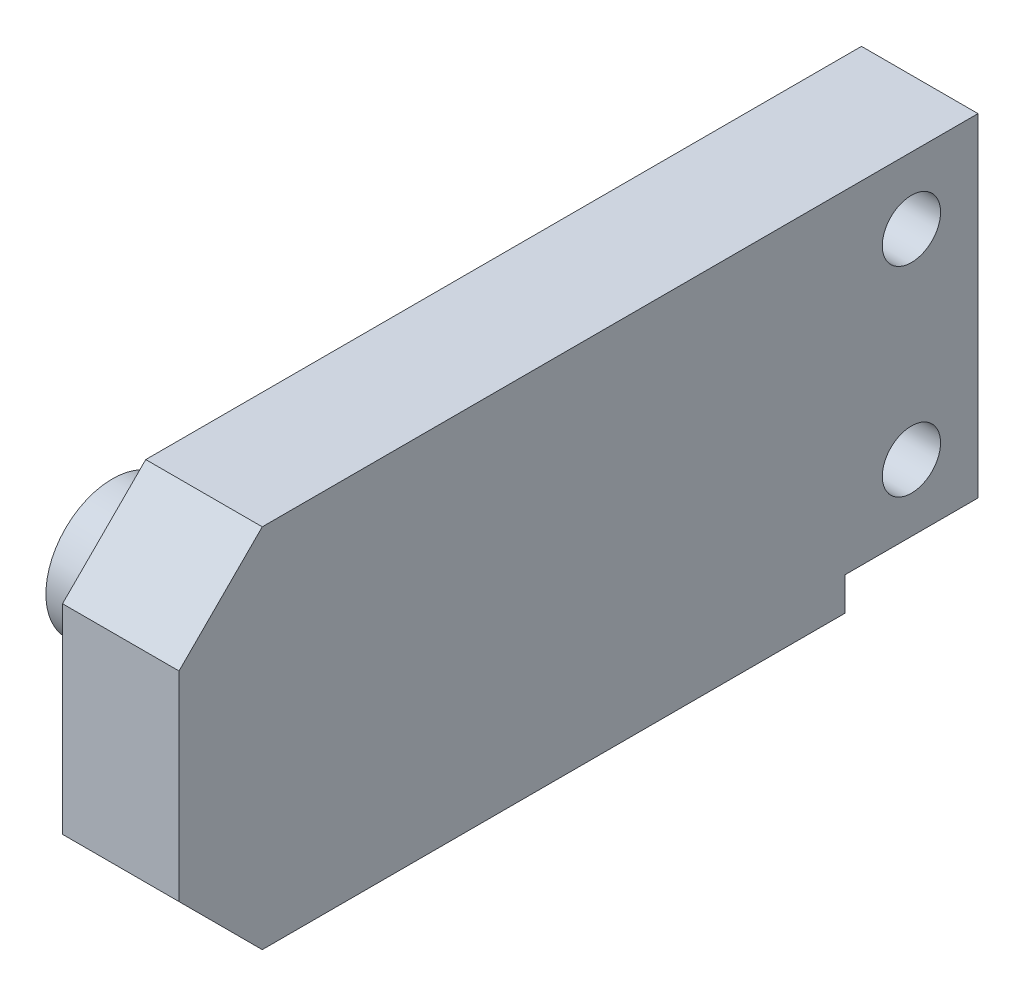
ISO-10303-21;
HEADER;
FILE_DESCRIPTION(('STEP AP214'),'2;1');
FILE_NAME('part.step','',(''),(''),'','','');
FILE_SCHEMA(('AUTOMOTIVE_DESIGN { 1 0 10303 214 1 1 1 1 }'));
ENDSEC;
DATA;
#1=APPLICATION_CONTEXT('core data for automotive mechanical design processes');
#2=APPLICATION_PROTOCOL_DEFINITION('international standard','automotive_design',2000,#1);
#3=PRODUCT_CONTEXT('',#1,'mechanical');
#4=PRODUCT('Part','Part','',(#3));
#5=PRODUCT_RELATED_PRODUCT_CATEGORY('part','',(#4));
#6=PRODUCT_DEFINITION_FORMATION('','',#4);
#7=PRODUCT_DEFINITION_CONTEXT('part definition',#1,'design');
#8=PRODUCT_DEFINITION('design','',#6,#7);
#9=PRODUCT_DEFINITION_SHAPE('','',#8);
#10=(LENGTH_UNIT() NAMED_UNIT(*) SI_UNIT(.MILLI.,.METRE.));
#11=(NAMED_UNIT(*) PLANE_ANGLE_UNIT() SI_UNIT($,.RADIAN.));
#12=(NAMED_UNIT(*) SI_UNIT($,.STERADIAN.) SOLID_ANGLE_UNIT());
#13=UNCERTAINTY_MEASURE_WITH_UNIT(LENGTH_MEASURE(1.E-05),#10,'distance_accuracy_value','');
#14=(GEOMETRIC_REPRESENTATION_CONTEXT(3) GLOBAL_UNCERTAINTY_ASSIGNED_CONTEXT((#13)) GLOBAL_UNIT_ASSIGNED_CONTEXT((#10,
#11,#12)) REPRESENTATION_CONTEXT('',''));
#15=CARTESIAN_POINT('',(0.,0.,0.));
#16=DIRECTION('',(0.,0.,1.));
#17=DIRECTION('',(1.,0.,0.));
#18=AXIS2_PLACEMENT_3D('',#15,#16,#17);
#19=CARTESIAN_POINT('',(7.,0.,10.));
#20=DIRECTION('',(0.,0.,-1.));
#21=DIRECTION('',(0.,1.,0.));
#22=AXIS2_PLACEMENT_3D('',#19,#20,#21);
#23=PLANE('',#22);
#24=DIRECTION('',(0.,-1.,0.));
#25=VECTOR('',#24,1.);
#26=CARTESIAN_POINT('',(0.,0.,10.));
#27=LINE('',#26,#25);
#28=CARTESIAN_POINT('',(0.,6.,10.));
#29=VERTEX_POINT('',#28);
#30=CARTESIAN_POINT('',(0.,-6.,10.));
#31=VERTEX_POINT('',#30);
#32=EDGE_CURVE('E151',#29,#31,#27,.T.);
#33=ORIENTED_EDGE('',*,*,#32,.T.);
#34=DIRECTION('',(-1.,0.,0.));
#35=VECTOR('',#34,1.);
#36=CARTESIAN_POINT('',(7.,-6.,10.));
#37=LINE('',#36,#35);
#38=CARTESIAN_POINT('',(7.,-6.,10.));
#39=VERTEX_POINT('',#38);
#40=EDGE_CURVE('E49',#39,#31,#37,.T.);
#41=ORIENTED_EDGE('',*,*,#40,.F.);
#42=DIRECTION('',(0.,-1.,0.));
#43=VECTOR('',#42,1.);
#44=CARTESIAN_POINT('',(7.,0.,10.));
#45=LINE('',#44,#43);
#46=CARTESIAN_POINT('',(7.,6.,10.));
#47=VERTEX_POINT('',#46);
#48=EDGE_CURVE('E193',#47,#39,#45,.T.);
#49=ORIENTED_EDGE('',*,*,#48,.F.);
#50=DIRECTION('',(-1.,0.,0.));
#51=VECTOR('',#50,1.);
#52=CARTESIAN_POINT('',(7.,6.,10.));
#53=LINE('',#52,#51);
#54=EDGE_CURVE('E139',#47,#29,#53,.T.);
#55=ORIENTED_EDGE('',*,*,#54,.T.);
#56=EDGE_LOOP('',(#33,#41,#49,#55));
#57=FACE_BOUND('',#56,.T.);
#58=ADVANCED_FACE('F41',(#57),#23,.F.);
#59=CARTESIAN_POINT('',(7.,-8.,8.));
#60=DIRECTION('',(0.,0.707106781186547,-0.707106781186548));
#61=DIRECTION('',(0.,0.707106781186548,0.707106781186547));
#62=AXIS2_PLACEMENT_3D('',#59,#60,#61);
#63=PLANE('',#62);
#64=DIRECTION('',(0.,-0.707106781186548,-0.707106781186547));
#65=VECTOR('',#64,1.);
#66=CARTESIAN_POINT('',(0.,-8.,8.));
#67=LINE('',#66,#65);
#68=CARTESIAN_POINT('',(0.,-11.,5.));
#69=VERTEX_POINT('',#68);
#70=EDGE_CURVE('E147',#31,#69,#67,.T.);
#71=ORIENTED_EDGE('',*,*,#70,.T.);
#72=DIRECTION('',(-1.,0.,0.));
#73=VECTOR('',#72,1.);
#74=CARTESIAN_POINT('',(7.,-11.,5.));
#75=LINE('',#74,#73);
#76=CARTESIAN_POINT('',(7.,-11.,5.));
#77=VERTEX_POINT('',#76);
#78=EDGE_CURVE('E137',#77,#69,#75,.T.);
#79=ORIENTED_EDGE('',*,*,#78,.F.);
#80=DIRECTION('',(0.,-0.707106781186548,-0.707106781186547));
#81=VECTOR('',#80,1.);
#82=CARTESIAN_POINT('',(7.,-8.,8.));
#83=LINE('',#82,#81);
#84=EDGE_CURVE('E100',#39,#77,#83,.T.);
#85=ORIENTED_EDGE('',*,*,#84,.F.);
#86=ORIENTED_EDGE('',*,*,#40,.T.);
#87=EDGE_LOOP('',(#71,#79,#85,#86));
#88=FACE_BOUND('',#87,.T.);
#89=ADVANCED_FACE('F146',(#88),#63,.F.);
#90=CARTESIAN_POINT('',(7.,-11.,0.));
#91=DIRECTION('',(0.,1.,0.));
#92=DIRECTION('',(0.,0.,1.));
#93=AXIS2_PLACEMENT_3D('',#90,#91,#92);
#94=PLANE('',#93);
#95=DIRECTION('',(0.,0.,-1.));
#96=VECTOR('',#95,1.);
#97=CARTESIAN_POINT('',(0.,-11.,0.));
#98=LINE('',#97,#96);
#99=CARTESIAN_POINT('',(0.,-11.,-30.));
#100=VERTEX_POINT('',#99);
#101=EDGE_CURVE('E155',#69,#100,#98,.T.);
#102=ORIENTED_EDGE('',*,*,#101,.T.);
#103=DIRECTION('',(-1.,0.,0.));
#104=VECTOR('',#103,1.);
#105=CARTESIAN_POINT('',(7.,-11.,-30.));
#106=LINE('',#105,#104);
#107=CARTESIAN_POINT('',(7.,-11.,-30.));
#108=VERTEX_POINT('',#107);
#109=EDGE_CURVE('E134',#108,#100,#106,.T.);
#110=ORIENTED_EDGE('',*,*,#109,.F.);
#111=DIRECTION('',(0.,0.,-1.));
#112=VECTOR('',#111,1.);
#113=CARTESIAN_POINT('',(7.,-11.,0.));
#114=LINE('',#113,#112);
#115=EDGE_CURVE('E126',#77,#108,#114,.T.);
#116=ORIENTED_EDGE('',*,*,#115,.F.);
#117=ORIENTED_EDGE('',*,*,#78,.T.);
#118=EDGE_LOOP('',(#102,#110,#116,#117));
#119=FACE_BOUND('',#118,.T.);
#120=ADVANCED_FACE('F198',(#119),#94,.F.);
#121=CARTESIAN_POINT('',(7.,0.,-30.));
#122=DIRECTION('',(0.,0.,1.));
#123=DIRECTION('',(1.,0.,0.));
#124=AXIS2_PLACEMENT_3D('',#121,#122,#123);
#125=PLANE('',#124);
#126=DIRECTION('',(0.,1.,0.));
#127=VECTOR('',#126,1.);
#128=CARTESIAN_POINT('',(0.,0.,-30.));
#129=LINE('',#128,#127);
#130=CARTESIAN_POINT('',(0.,-9.00000000000001,-30.));
#131=VERTEX_POINT('',#130);
#132=EDGE_CURVE('E133',#100,#131,#129,.T.);
#133=ORIENTED_EDGE('',*,*,#132,.T.);
#134=DIRECTION('',(-1.,0.,0.));
#135=VECTOR('',#134,1.);
#136=CARTESIAN_POINT('',(7.,-9.00000000000001,-30.));
#137=LINE('',#136,#135);
#138=CARTESIAN_POINT('',(7.,-9.00000000000001,-30.));
#139=VERTEX_POINT('',#138);
#140=EDGE_CURVE('E116',#139,#131,#137,.T.);
#141=ORIENTED_EDGE('',*,*,#140,.F.);
#142=DIRECTION('',(0.,1.,0.));
#143=VECTOR('',#142,1.);
#144=CARTESIAN_POINT('',(7.,0.,-30.));
#145=LINE('',#144,#143);
#146=EDGE_CURVE('E120',#108,#139,#145,.T.);
#147=ORIENTED_EDGE('',*,*,#146,.F.);
#148=ORIENTED_EDGE('',*,*,#109,.T.);
#149=EDGE_LOOP('',(#133,#141,#147,#148));
#150=FACE_BOUND('',#149,.T.);
#151=ADVANCED_FACE('F131',(#150),#125,.F.);
#152=CARTESIAN_POINT('',(7.,-9.00000000000001,0.));
#153=DIRECTION('',(0.,-1.,0.));
#154=DIRECTION('',(0.,0.,-1.));
#155=AXIS2_PLACEMENT_3D('',#152,#153,#154);
#156=PLANE('',#155);
#157=DIRECTION('',(-1.,0.,0.));
#158=VECTOR('',#157,1.);
#159=CARTESIAN_POINT('',(7.,-9.00000000000001,-38.));
#160=LINE('',#159,#158);
#161=CARTESIAN_POINT('',(7.,-9.00000000000001,-38.));
#162=VERTEX_POINT('',#161);
#163=CARTESIAN_POINT('',(0.,-9.00000000000001,-38.));
#164=VERTEX_POINT('',#163);
#165=EDGE_CURVE('E56',#162,#164,#160,.T.);
#166=ORIENTED_EDGE('',*,*,#165,.F.);
#167=DIRECTION('',(0.,0.,1.));
#168=VECTOR('',#167,1.);
#169=CARTESIAN_POINT('',(7.,-9.00000000000001,0.));
#170=LINE('',#169,#168);
#171=EDGE_CURVE('E111',#162,#139,#170,.T.);
#172=ORIENTED_EDGE('',*,*,#171,.T.);
#173=ORIENTED_EDGE('',*,*,#140,.T.);
#174=DIRECTION('',(0.,0.,1.));
#175=VECTOR('',#174,1.);
#176=CARTESIAN_POINT('',(0.,-9.00000000000001,0.));
#177=LINE('',#176,#175);
#178=EDGE_CURVE('E164',#164,#131,#177,.T.);
#179=ORIENTED_EDGE('',*,*,#178,.F.);
#180=EDGE_LOOP('',(#166,#172,#173,#179));
#181=FACE_BOUND('',#180,.T.);
#182=ADVANCED_FACE('F113',(#181),#156,.T.);
#183=CARTESIAN_POINT('',(7.,11.,0.));
#184=DIRECTION('',(0.,1.,0.));
#185=DIRECTION('',(0.,0.,1.));
#186=AXIS2_PLACEMENT_3D('',#183,#184,#185);
#187=PLANE('',#186);
#188=DIRECTION('',(1.,0.,0.));
#189=VECTOR('',#188,1.);
#190=CARTESIAN_POINT('',(7.,11.,-38.));
#191=LINE('',#190,#189);
#192=CARTESIAN_POINT('',(0.,11.,-38.));
#193=VERTEX_POINT('',#192);
#194=CARTESIAN_POINT('',(7.,11.,-38.));
#195=VERTEX_POINT('',#194);
#196=EDGE_CURVE('E206',#193,#195,#191,.T.);
#197=ORIENTED_EDGE('',*,*,#196,.F.);
#198=DIRECTION('',(0.,0.,-1.));
#199=VECTOR('',#198,1.);
#200=CARTESIAN_POINT('',(0.,11.,0.));
#201=LINE('',#200,#199);
#202=CARTESIAN_POINT('',(0.,11.,5.));
#203=VERTEX_POINT('',#202);
#204=EDGE_CURVE('E166',#203,#193,#201,.T.);
#205=ORIENTED_EDGE('',*,*,#204,.F.);
#206=DIRECTION('',(-1.,0.,0.));
#207=VECTOR('',#206,1.);
#208=CARTESIAN_POINT('',(7.,11.,5.));
#209=LINE('',#208,#207);
#210=CARTESIAN_POINT('',(7.,11.,5.));
#211=VERTEX_POINT('',#210);
#212=EDGE_CURVE('E135',#211,#203,#209,.T.);
#213=ORIENTED_EDGE('',*,*,#212,.F.);
#214=DIRECTION('',(0.,0.,-1.));
#215=VECTOR('',#214,1.);
#216=CARTESIAN_POINT('',(7.,11.,0.));
#217=LINE('',#216,#215);
#218=EDGE_CURVE('E119',#211,#195,#217,.T.);
#219=ORIENTED_EDGE('',*,*,#218,.T.);
#220=EDGE_LOOP('',(#197,#205,#213,#219));
#221=FACE_BOUND('',#220,.T.);
#222=ADVANCED_FACE('F209',(#221),#187,.T.);
#223=CARTESIAN_POINT('',(7.,7.00000000000001,-34.));
#224=DIRECTION('',(-1.,0.,0.));
#225=DIRECTION('',(0.,0.,1.));
#226=AXIS2_PLACEMENT_3D('',#223,#224,#225);
#227=CYLINDRICAL_SURFACE('',#226,1.75);
#228=CARTESIAN_POINT('',(7.,7.00000000000001,-34.));
#229=DIRECTION('',(1.,0.,0.));
#230=DIRECTION('',(0.,0.,-1.));
#231=AXIS2_PLACEMENT_3D('',#228,#229,#230);
#232=CIRCLE('',#231,1.75);
#233=CARTESIAN_POINT('',(7.,7.00000000000001,-35.75));
#234=VERTEX_POINT('',#233);
#235=EDGE_CURVE('E190',#234,#234,#232,.T.);
#236=ORIENTED_EDGE('',*,*,#235,.T.);
#237=EDGE_LOOP('',(#236));
#238=FACE_BOUND('',#237,.T.);
#239=CARTESIAN_POINT('',(0.,7.00000000000001,-34.));
#240=DIRECTION('',(1.,0.,0.));
#241=DIRECTION('',(0.,0.,-1.));
#242=AXIS2_PLACEMENT_3D('',#239,#240,#241);
#243=CIRCLE('',#242,1.75);
#244=CARTESIAN_POINT('',(0.,7.00000000000001,-35.75));
#245=VERTEX_POINT('',#244);
#246=EDGE_CURVE('E153',#245,#245,#243,.T.);
#247=ORIENTED_EDGE('',*,*,#246,.F.);
#248=EDGE_LOOP('',(#247));
#249=FACE_BOUND('',#248,.T.);
#250=ADVANCED_FACE('F220',(#238,#249),#227,.F.);
#251=CARTESIAN_POINT('',(7.,-5.,-34.));
#252=DIRECTION('',(-1.,0.,0.));
#253=DIRECTION('',(0.,0.,1.));
#254=AXIS2_PLACEMENT_3D('',#251,#252,#253);
#255=CYLINDRICAL_SURFACE('',#254,1.75);
#256=CARTESIAN_POINT('',(7.,-5.,-34.));
#257=DIRECTION('',(1.,0.,0.));
#258=DIRECTION('',(0.,0.,-1.));
#259=AXIS2_PLACEMENT_3D('',#256,#257,#258);
#260=CIRCLE('',#259,1.75);
#261=CARTESIAN_POINT('',(7.,-5.,-35.75));
#262=VERTEX_POINT('',#261);
#263=EDGE_CURVE('E169',#262,#262,#260,.T.);
#264=ORIENTED_EDGE('',*,*,#263,.T.);
#265=EDGE_LOOP('',(#264));
#266=FACE_BOUND('',#265,.T.);
#267=CARTESIAN_POINT('',(0.,-5.,-34.));
#268=DIRECTION('',(1.,0.,0.));
#269=DIRECTION('',(0.,0.,-1.));
#270=AXIS2_PLACEMENT_3D('',#267,#268,#269);
#271=CIRCLE('',#270,1.75);
#272=CARTESIAN_POINT('',(0.,-5.,-35.75));
#273=VERTEX_POINT('',#272);
#274=EDGE_CURVE('E158',#273,#273,#271,.T.);
#275=ORIENTED_EDGE('',*,*,#274,.F.);
#276=EDGE_LOOP('',(#275));
#277=FACE_BOUND('',#276,.T.);
#278=ADVANCED_FACE('F43',(#266,#277),#255,.F.);
#279=CARTESIAN_POINT('',(7.,8.,8.00000000000001));
#280=DIRECTION('',(0.,-0.707106781186547,-0.707106781186548));
#281=DIRECTION('',(0.,0.707106781186548,-0.707106781186547));
#282=AXIS2_PLACEMENT_3D('',#279,#280,#281);
#283=PLANE('',#282);
#284=DIRECTION('',(0.,-0.707106781186548,0.707106781186547));
#285=VECTOR('',#284,1.);
#286=CARTESIAN_POINT('',(0.,8.,8.00000000000001));
#287=LINE('',#286,#285);
#288=EDGE_CURVE('E91',#203,#29,#287,.T.);
#289=ORIENTED_EDGE('',*,*,#288,.T.);
#290=ORIENTED_EDGE('',*,*,#54,.F.);
#291=DIRECTION('',(0.,-0.707106781186548,0.707106781186547));
#292=VECTOR('',#291,1.);
#293=CARTESIAN_POINT('',(7.,8.,8.00000000000001));
#294=LINE('',#293,#292);
#295=EDGE_CURVE('E64',#211,#47,#294,.T.);
#296=ORIENTED_EDGE('',*,*,#295,.F.);
#297=ORIENTED_EDGE('',*,*,#212,.T.);
#298=EDGE_LOOP('',(#289,#290,#296,#297));
#299=FACE_BOUND('',#298,.T.);
#300=ADVANCED_FACE('F211',(#299),#283,.F.);
#301=CARTESIAN_POINT('',(7.,0.,0.));
#302=DIRECTION('',(1.,0.,0.));
#303=DIRECTION('',(0.,0.,-1.));
#304=AXIS2_PLACEMENT_3D('',#301,#302,#303);
#305=PLANE('',#304);
#306=DIRECTION('',(0.,-1.,0.));
#307=VECTOR('',#306,1.);
#308=CARTESIAN_POINT('',(7.,0.,-38.));
#309=LINE('',#308,#307);
#310=EDGE_CURVE('E183',#195,#162,#309,.T.);
#311=ORIENTED_EDGE('',*,*,#310,.F.);
#312=ORIENTED_EDGE('',*,*,#218,.F.);
#313=ORIENTED_EDGE('',*,*,#295,.T.);
#314=ORIENTED_EDGE('',*,*,#48,.T.);
#315=ORIENTED_EDGE('',*,*,#84,.T.);
#316=ORIENTED_EDGE('',*,*,#115,.T.);
#317=ORIENTED_EDGE('',*,*,#146,.T.);
#318=ORIENTED_EDGE('',*,*,#171,.F.);
#319=EDGE_LOOP('',(#311,#312,#313,#314,#315,#316,#317,#318));
#320=FACE_BOUND('',#319,.T.);
#321=ORIENTED_EDGE('',*,*,#263,.F.);
#322=EDGE_LOOP('',(#321));
#323=FACE_BOUND('',#322,.T.);
#324=ORIENTED_EDGE('',*,*,#235,.F.);
#325=EDGE_LOOP('',(#324));
#326=FACE_BOUND('',#325,.T.);
#327=ADVANCED_FACE('F123',(#320,#323,#326),#305,.T.);
#328=CARTESIAN_POINT('',(0.,0.,0.));
#329=DIRECTION('',(1.,0.,0.));
#330=DIRECTION('',(0.,0.,-1.));
#331=AXIS2_PLACEMENT_3D('',#328,#329,#330);
#332=PLANE('',#331);
#333=CARTESIAN_POINT('',(0.,0.,0.));
#334=DIRECTION('',(1.,0.,0.));
#335=DIRECTION('',(0.,0.,-1.));
#336=AXIS2_PLACEMENT_3D('',#333,#334,#335);
#337=CIRCLE('',#336,4.);
#338=CARTESIAN_POINT('',(0.,0.,-4.));
#339=VERTEX_POINT('',#338);
#340=EDGE_CURVE('E178',#339,#339,#337,.T.);
#341=ORIENTED_EDGE('',*,*,#340,.T.);
#342=EDGE_LOOP('',(#341));
#343=FACE_BOUND('',#342,.T.);
#344=ORIENTED_EDGE('',*,*,#274,.T.);
#345=EDGE_LOOP('',(#344));
#346=FACE_BOUND('',#345,.T.);
#347=ORIENTED_EDGE('',*,*,#246,.T.);
#348=EDGE_LOOP('',(#347));
#349=FACE_BOUND('',#348,.T.);
#350=ORIENTED_EDGE('',*,*,#204,.T.);
#351=DIRECTION('',(0.,-1.,0.));
#352=VECTOR('',#351,1.);
#353=CARTESIAN_POINT('',(0.,0.,-38.));
#354=LINE('',#353,#352);
#355=EDGE_CURVE('E11',#193,#164,#354,.T.);
#356=ORIENTED_EDGE('',*,*,#355,.T.);
#357=ORIENTED_EDGE('',*,*,#178,.T.);
#358=ORIENTED_EDGE('',*,*,#132,.F.);
#359=ORIENTED_EDGE('',*,*,#101,.F.);
#360=ORIENTED_EDGE('',*,*,#70,.F.);
#361=ORIENTED_EDGE('',*,*,#32,.F.);
#362=ORIENTED_EDGE('',*,*,#288,.F.);
#363=EDGE_LOOP('',(#350,#356,#357,#358,#359,#360,#361,#362));
#364=FACE_BOUND('',#363,.T.);
#365=ADVANCED_FACE('F199',(#343,#346,#349,#364),#332,.F.);
#366=CARTESIAN_POINT('',(-7.,0.,0.));
#367=DIRECTION('',(1.,0.,0.));
#368=DIRECTION('',(0.,0.,-1.));
#369=AXIS2_PLACEMENT_3D('',#366,#367,#368);
#370=CYLINDRICAL_SURFACE('',#369,4.);
#371=CARTESIAN_POINT('',(-7.,0.,0.));
#372=DIRECTION('',(1.,0.,0.));
#373=DIRECTION('',(0.,0.,-1.));
#374=AXIS2_PLACEMENT_3D('',#371,#372,#373);
#375=CIRCLE('',#374,4.);
#376=CARTESIAN_POINT('',(-7.,0.,-4.));
#377=VERTEX_POINT('',#376);
#378=EDGE_CURVE('E174',#377,#377,#375,.T.);
#379=ORIENTED_EDGE('',*,*,#378,.T.);
#380=EDGE_LOOP('',(#379));
#381=FACE_BOUND('',#380,.T.);
#382=ORIENTED_EDGE('',*,*,#340,.F.);
#383=EDGE_LOOP('',(#382));
#384=FACE_BOUND('',#383,.T.);
#385=ADVANCED_FACE('F242',(#381,#384),#370,.T.);
#386=CARTESIAN_POINT('',(-7.,0.,0.));
#387=DIRECTION('',(1.,0.,0.));
#388=DIRECTION('',(0.,0.,-1.));
#389=AXIS2_PLACEMENT_3D('',#386,#387,#388);
#390=PLANE('',#389);
#391=ORIENTED_EDGE('',*,*,#378,.F.);
#392=EDGE_LOOP('',(#391));
#393=FACE_BOUND('',#392,.T.);
#394=ADVANCED_FACE('F247',(#393),#390,.F.);
#395=CARTESIAN_POINT('',(-7.,-47.2970503296153,-38.));
#396=DIRECTION('',(0.,0.,1.));
#397=DIRECTION('',(1.,0.,0.));
#398=AXIS2_PLACEMENT_3D('',#395,#396,#397);
#399=PLANE('',#398);
#400=ORIENTED_EDGE('',*,*,#310,.T.);
#401=ORIENTED_EDGE('',*,*,#165,.T.);
#402=ORIENTED_EDGE('',*,*,#355,.F.);
#403=ORIENTED_EDGE('',*,*,#196,.T.);
#404=EDGE_LOOP('',(#400,#401,#402,#403));
#405=FACE_BOUND('',#404,.T.);
#406=ADVANCED_FACE('F204',(#405),#399,.F.);
#407=CLOSED_SHELL('',(#58,#89,#120,#151,#182,#222,#250,#278,#300,#327,#365,#385,#394,#406));
#408=MANIFOLD_SOLID_BREP('B2',#407);
#409=ADVANCED_BREP_SHAPE_REPRESENTATION('',(#18,#408),#14);
#410=SHAPE_DEFINITION_REPRESENTATION(#9,#409);
ENDSEC;
END-ISO-10303-21;
